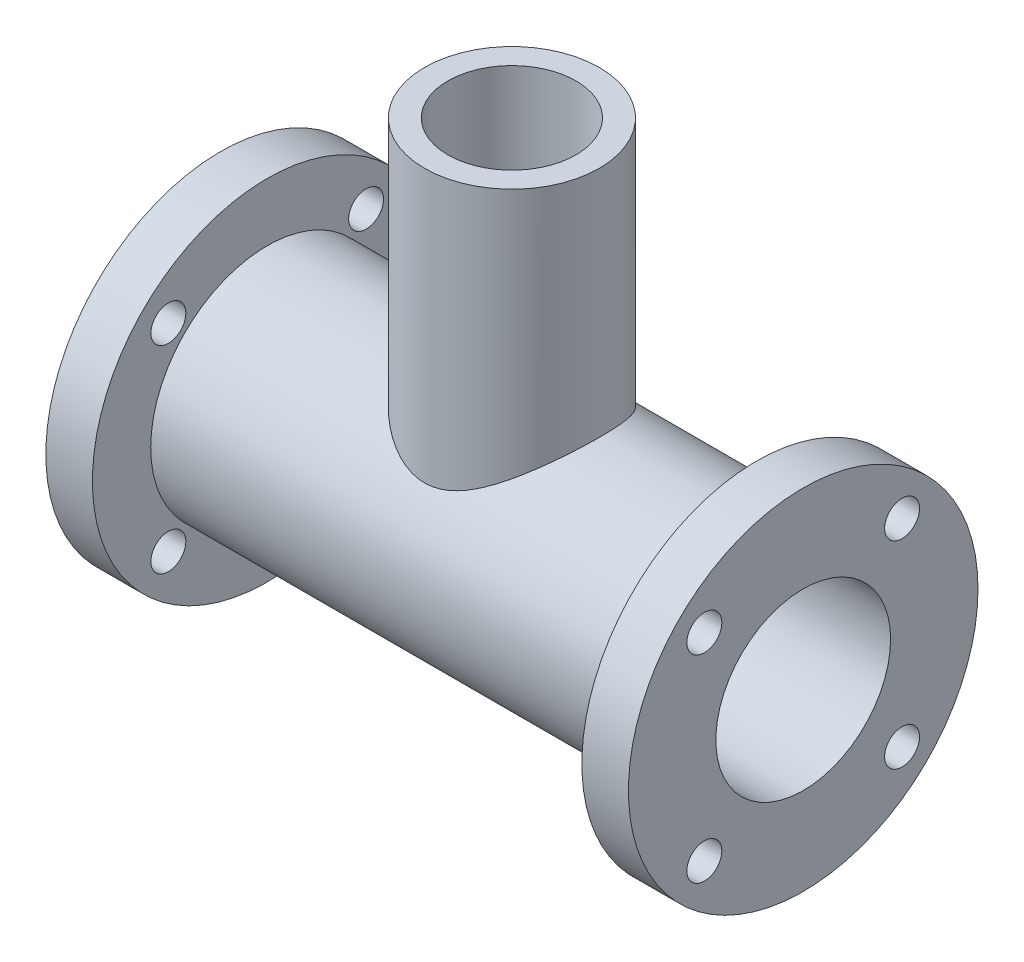
ISO-10303-21;
HEADER;
FILE_DESCRIPTION(('STEP AP214'),'2;1');
FILE_NAME('part.step','',(''),(''),'','','');
FILE_SCHEMA(('AUTOMOTIVE_DESIGN { 1 0 10303 214 1 1 1 1 }'));
ENDSEC;
DATA;
#1=APPLICATION_CONTEXT('core data for automotive mechanical design processes');
#2=APPLICATION_PROTOCOL_DEFINITION('international standard','automotive_design',2000,#1);
#3=PRODUCT_CONTEXT('',#1,'mechanical');
#4=PRODUCT('Part','Part','',(#3));
#5=PRODUCT_RELATED_PRODUCT_CATEGORY('part','',(#4));
#6=PRODUCT_DEFINITION_FORMATION('','',#4);
#7=PRODUCT_DEFINITION_CONTEXT('part definition',#1,'design');
#8=PRODUCT_DEFINITION('design','',#6,#7);
#9=PRODUCT_DEFINITION_SHAPE('','',#8);
#10=(LENGTH_UNIT() NAMED_UNIT(*) SI_UNIT(.MILLI.,.METRE.));
#11=(NAMED_UNIT(*) PLANE_ANGLE_UNIT() SI_UNIT($,.RADIAN.));
#12=(NAMED_UNIT(*) SI_UNIT($,.STERADIAN.) SOLID_ANGLE_UNIT());
#13=UNCERTAINTY_MEASURE_WITH_UNIT(LENGTH_MEASURE(1.E-05),#10,'distance_accuracy_value','');
#14=(GEOMETRIC_REPRESENTATION_CONTEXT(3) GLOBAL_UNCERTAINTY_ASSIGNED_CONTEXT((#13)) GLOBAL_UNIT_ASSIGNED_CONTEXT((#10,
#11,#12)) REPRESENTATION_CONTEXT('',''));
#15=CARTESIAN_POINT('',(0.,0.,0.));
#16=DIRECTION('',(0.,0.,1.));
#17=DIRECTION('',(1.,0.,0.));
#18=AXIS2_PLACEMENT_3D('',#15,#16,#17);
#19=CARTESIAN_POINT('',(50.,0.,0.));
#20=DIRECTION('',(-1.,0.,0.));
#21=DIRECTION('',(0.,0.,1.));
#22=AXIS2_PLACEMENT_3D('',#19,#20,#21);
#23=CYLINDRICAL_SURFACE('',#22,20.);
#24=CARTESIAN_POINT('',(-42.,0.,0.));
#25=DIRECTION('',(1.,0.,0.));
#26=DIRECTION('',(0.,0.,-1.));
#27=AXIS2_PLACEMENT_3D('',#24,#25,#26);
#28=CIRCLE('',#27,20.);
#29=CARTESIAN_POINT('',(-42.,0.,-20.));
#30=VERTEX_POINT('',#29);
#31=EDGE_CURVE('E71',#30,#30,#28,.T.);
#32=ORIENTED_EDGE('',*,*,#31,.T.);
#33=EDGE_LOOP('',(#32));
#34=FACE_BOUND('',#33,.T.);
#35=CARTESIAN_POINT('',(42.,0.,0.));
#36=DIRECTION('',(1.,0.,0.));
#37=DIRECTION('',(0.,0.,-1.));
#38=AXIS2_PLACEMENT_3D('',#35,#36,#37);
#39=CIRCLE('',#38,20.);
#40=CARTESIAN_POINT('',(42.,0.,-20.));
#41=VERTEX_POINT('',#40);
#42=EDGE_CURVE('E64',#41,#41,#39,.T.);
#43=ORIENTED_EDGE('',*,*,#42,.F.);
#44=EDGE_LOOP('',(#43));
#45=FACE_BOUND('',#44,.T.);
#46=CARTESIAN_POINT('',(0.,13.228756555323,-15.));
#47=CARTESIAN_POINT('',(-0.35007989032729,13.2287668094619,-14.9999950153257));
#48=CARTESIAN_POINT('',(-0.700236713845623,13.2427343184002,-14.9877084662531));
#49=CARTESIAN_POINT('',(-1.39674329707938,13.2977503238063,-14.9389130422472));
#50=CARTESIAN_POINT('',(-1.74309174740027,13.3388078555466,-14.9023960857796));
#51=CARTESIAN_POINT('',(-2.42936786240107,13.4456917360412,-14.8060300167238));
#52=CARTESIAN_POINT('',(-2.76927984254846,13.5115720135098,-14.7461300931283));
#53=CARTESIAN_POINT('',(-3.4397076158768,13.6647324664701,-14.6043124055875));
#54=CARTESIAN_POINT('',(-3.77021704322413,13.7520267724489,-14.5223800996731));
#55=CARTESIAN_POINT('',(-4.41546480166887,13.9428350128198,-14.3392663378897));
#56=CARTESIAN_POINT('',(-4.7303610108751,14.0460993413177,-14.2383766850737));
#57=CARTESIAN_POINT('',(-5.34847307548841,14.2661400009491,-14.0178987853672));
#58=CARTESIAN_POINT('',(-5.6516929518917,14.3829116240745,-13.8983170485833));
#59=CARTESIAN_POINT('',(-6.24616943381679,14.6267269354183,-13.6414881549899));
#60=CARTESIAN_POINT('',(-6.5374281132017,14.7537688315145,-13.5042440777257));
#61=CARTESIAN_POINT('',(-7.10791224058062,15.0152639605448,-13.2128793945192));
#62=CARTESIAN_POINT('',(-7.38713681363701,15.1497177307435,-13.0587575643577));
#63=CARTESIAN_POINT('',(-7.99071956284569,15.4521775664433,-12.7002402869969));
#64=CARTESIAN_POINT('',(-8.31227897723436,15.6213119404169,-12.4920767667057));
#65=CARTESIAN_POINT('',(-8.93746542989707,15.9627612947625,-12.0527051205516));
#66=CARTESIAN_POINT('',(-9.24109098977488,16.13507653582,-11.8214950990367));
#67=CARTESIAN_POINT('',(-9.83038305835604,16.4796612724476,-11.336200767858));
#68=CARTESIAN_POINT('',(-10.1160237485836,16.6519303639669,-11.0820847920122));
#69=CARTESIAN_POINT('',(-10.6681497813648,16.9930078783519,-10.5516419021681));
#70=CARTESIAN_POINT('',(-10.934633531495,17.1618160126933,-10.2753131457642));
#71=CARTESIAN_POINT('',(-11.4998486946518,17.5268619129745,-9.64202111520891));
#72=CARTESIAN_POINT('',(-11.7940279078987,17.7216481226697,-9.2801252453224));
#73=CARTESIAN_POINT('',(-12.3505638493801,18.0968011898211,-8.52545502777757));
#74=CARTESIAN_POINT('',(-12.6129134212813,18.2771648015145,-8.13267376867953));
#75=CARTESIAN_POINT('',(-13.1020621368342,18.6180919097207,-7.31854084159984));
#76=CARTESIAN_POINT('',(-13.3289282198199,18.7786925637549,-6.89724517173384));
#77=CARTESIAN_POINT('',(-13.7439395955394,19.0755036601499,-6.02791743999363));
#78=CARTESIAN_POINT('',(-13.9321053715779,19.2117269999534,-5.57989968441866));
#79=CARTESIAN_POINT('',(-14.2155206181019,19.4184117702375,-4.79954239415013));
#80=CARTESIAN_POINT('',(-14.3216751503084,19.4963138119554,-4.47308557241265));
#81=CARTESIAN_POINT('',(-14.5119991391525,19.6365467152,-3.81058674167509));
#82=CARTESIAN_POINT('',(-14.5961738392268,19.6988812902957,-3.47454703999168));
#83=CARTESIAN_POINT('',(-14.7413760869837,19.8067111708165,-2.79507530852944));
#84=CARTESIAN_POINT('',(-14.8024190854446,19.8522177160016,-2.45164837563999));
#85=CARTESIAN_POINT('',(-14.9005493680025,19.9254938188065,-1.75948746314503));
#86=CARTESIAN_POINT('',(-14.9376357933791,19.9532627406231,-1.41075329376086));
#87=CARTESIAN_POINT('',(-14.9873357006868,19.9904967082937,-0.709643343864726));
#88=CARTESIAN_POINT('',(-14.9998847978291,19.9999135990731,-0.357260415366052));
#89=CARTESIAN_POINT('',(-15.0001136198624,20.0000852141955,0.347516775524046));
#90=CARTESIAN_POINT('',(-14.9877934431648,19.9908400123871,0.699911037865103));
#91=CARTESIAN_POINT('',(-14.9384782769663,19.9538935464116,1.40205493706976));
#92=CARTESIAN_POINT('',(-14.901478409887,19.926188633955,1.75180403733445));
#93=CARTESIAN_POINT('',(-14.8033777740602,19.8529325341786,2.44599527790974));
#94=CARTESIAN_POINT('',(-14.7422771652691,19.8073814653035,2.79043745342655));
#95=CARTESIAN_POINT('',(-14.5993796559603,19.7012609038883,3.45994787566955));
#96=CARTESIAN_POINT('',(-14.5183665754014,19.6412616302281,3.78527506214432));
#97=CARTESIAN_POINT('',(-14.3357338481969,19.506651612435,4.4269651160663));
#98=CARTESIAN_POINT('',(-14.2341148219447,19.4320413082059,4.74332825307189));
#99=CARTESIAN_POINT('',(-14.0114083976574,19.2695036472713,5.36559938852795));
#100=CARTESIAN_POINT('',(-13.8903200079904,19.1815756122678,5.67150685347756));
#101=CARTESIAN_POINT('',(-13.6298601756864,18.9938132834954,6.27167876281055));
#102=CARTESIAN_POINT('',(-13.4904862401191,18.8939773664536,6.56594161251113));
#103=CARTESIAN_POINT('',(-13.1786322414654,18.672520363577,7.17303017708289));
#104=CARTESIAN_POINT('',(-13.0042018371785,18.5497109290933,7.4844202707271));
#105=CARTESIAN_POINT('',(-12.6358530539302,18.2933673193193,8.09080316859151));
#106=CARTESIAN_POINT('',(-12.4419334865934,18.1598324901349,8.38579497120065));
#107=CARTESIAN_POINT('',(-12.0358210694146,17.8840361714195,8.95893137316532));
#108=CARTESIAN_POINT('',(-11.8236161634749,17.7417689423997,9.23706464813135));
#109=CARTESIAN_POINT('',(-11.3821811130353,17.4506880226699,9.77585129777695));
#110=CARTESIAN_POINT('',(-11.1529492476372,17.3018736708699,10.0365029005209));
#111=CARTESIAN_POINT('',(-10.6316991686249,16.9701205767747,10.5895421004239));
#112=CARTESIAN_POINT('',(-10.3362007154333,16.7862279061822,10.878085644726));
#113=CARTESIAN_POINT('',(-9.7233038384538,16.4159365254069,11.4292287850781));
#114=CARTESIAN_POINT('',(-9.40590119891681,16.2295373384013,11.6918233631243));
#115=CARTESIAN_POINT('',(-8.74979915450459,15.858302340693,12.1906083543206));
#116=CARTESIAN_POINT('',(-8.41108857565742,15.6734674089103,12.4267847302495));
#117=CARTESIAN_POINT('',(-7.71294764061094,15.3101499386323,12.8717420275264));
#118=CARTESIAN_POINT('',(-7.35352193904427,15.1316659875544,13.0805290689084));
#119=CARTESIAN_POINT('',(-6.68701295227638,14.8205031013214,13.4311696944969));
#120=CARTESIAN_POINT('',(-6.38357579620466,14.6857297334454,13.5781048697272));
#121=CARTESIAN_POINT('',(-5.76355405942468,14.4270297328062,13.8526668341882));
#122=CARTESIAN_POINT('',(-5.44696962786256,14.3031029770457,13.9802938423796));
#123=CARTESIAN_POINT('',(-4.80163600989962,14.0700166455556,14.2148490534225));
#124=CARTESIAN_POINT('',(-4.47291052978962,13.9608300481304,14.3218152911567));
#125=CARTESIAN_POINT('',(-3.80362399005992,13.7610209649693,14.5139086704768));
#126=CARTESIAN_POINT('',(-3.4630660427737,13.6703936401216,14.5990415063297));
#127=CARTESIAN_POINT('',(-2.84026434696751,13.5275389713065,14.7313679472066));
#128=CARTESIAN_POINT('',(-2.55983497252504,13.4712610794501,14.7827364870528));
#129=CARTESIAN_POINT('',(-1.99372983448241,13.3752461877063,14.8696672529289));
#130=CARTESIAN_POINT('',(-1.70805474733861,13.3355070704999,14.9052315022874));
#131=CARTESIAN_POINT('',(-1.13349558316175,13.2741604984585,14.959891833129));
#132=CARTESIAN_POINT('',(-0.844615334096402,13.2525333708564,14.9790057831212));
#133=CARTESIAN_POINT('',(-0.265421830878931,13.2282555633106,15.0004508078897));
#134=CARTESIAN_POINT('',(0.0248914379791947,13.2256050785168,15.0027817100745));
#135=CARTESIAN_POINT('',(0.60479891875946,13.2394003046486,14.9906090629994));
#136=CARTESIAN_POINT('',(0.894392862565885,13.2558523010735,14.9760999726925));
#137=CARTESIAN_POINT('',(1.47060869461576,13.3071526572066,14.9305342015992));
#138=CARTESIAN_POINT('',(1.75723057945352,13.3420010379927,14.899477501853));
#139=CARTESIAN_POINT('',(2.32600868418222,13.4287449861106,14.821342763958));
#140=CARTESIAN_POINT('',(2.60815892332743,13.4806616469267,14.7742448990591));
#141=CARTESIAN_POINT('',(3.16634198771834,13.599679206039,14.6647622054555));
#142=CARTESIAN_POINT('',(3.44237112067613,13.6667890093158,14.6023684097396));
#143=CARTESIAN_POINT('',(4.08915667335947,13.8416512274319,14.4370383650048));
#144=CARTESIAN_POINT('',(4.45670766039784,13.9552149092084,14.3276679286621));
#145=CARTESIAN_POINT('',(5.17650775566882,14.2014688311673,14.0836178702821));
#146=CARTESIAN_POINT('',(5.52875682065086,14.3341591254059,13.9489381767143));
#147=CARTESIAN_POINT('',(6.21795386001206,14.6138150964665,13.6556771716543));
#148=CARTESIAN_POINT('',(6.55487655591901,14.7608031856442,13.4970581124334));
#149=CARTESIAN_POINT('',(7.21256450610969,15.0643947755603,13.1573517779834));
#150=CARTESIAN_POINT('',(7.53333121606221,15.2209974071885,12.9762665320879));
#151=CARTESIAN_POINT('',(8.16973820461822,15.5456452157281,12.58569310029));
#152=CARTESIAN_POINT('',(8.48479239336158,15.7138992428473,12.375424903332));
#153=CARTESIAN_POINT('',(9.09725927872176,16.0528843684044,11.932422780117));
#154=CARTESIAN_POINT('',(9.3946719071635,16.2236154764118,11.6996887670508));
#155=CARTESIAN_POINT('',(9.97152383545865,16.5643325768962,11.2121086847205));
#156=CARTESIAN_POINT('',(10.2509551692435,16.7343182084577,10.9572529309388));
#157=CARTESIAN_POINT('',(10.7909545658109,17.0704442564019,10.425872067627));
#158=CARTESIAN_POINT('',(11.0515204844792,17.2365842342586,10.149344502441));
#159=CARTESIAN_POINT('',(11.6074930001012,17.5977256226589,9.51219255190244));
#160=CARTESIAN_POINT('',(11.8980704729062,17.791100358514,9.14639590077838));
#161=CARTESIAN_POINT('',(12.4470273815066,18.1628116618176,8.38404078648336));
#162=CARTESIAN_POINT('',(12.7053995084894,18.3411448127091,7.98747537353446));
#163=CARTESIAN_POINT('',(13.1861994708645,18.6774302216855,7.16591048622996));
#164=CARTESIAN_POINT('',(13.4086879809183,18.835416790138,6.74096076434239));
#165=CARTESIAN_POINT('',(13.8144291894275,19.1263812242272,5.86466860638735));
#166=CARTESIAN_POINT('',(13.9977030632752,19.2593725822092,5.41334058274982));
#167=CARTESIAN_POINT('',(14.2718936292022,19.459730248052,4.62917373862269));
#168=CARTESIAN_POINT('',(14.3739365835652,19.5347457585876,4.30212897093934));
#169=CARTESIAN_POINT('',(14.5559953401008,19.6690928432019,3.63884319439732));
#170=CARTESIAN_POINT('',(14.636016389643,19.7284281534177,3.30260439731683));
#171=CARTESIAN_POINT('',(14.7729141880237,19.8302017235116,2.62317001158236));
#172=CARTESIAN_POINT('',(14.8298071056262,19.8726517873344,2.27997945968527));
#173=CARTESIAN_POINT('',(14.9196977597463,19.9398216316173,1.58873612359809));
#174=CARTESIAN_POINT('',(14.952694603447,19.9645407496047,1.24068315823128));
#175=CARTESIAN_POINT('',(14.9943238587307,19.9957384632415,0.541474492697201));
#176=CARTESIAN_POINT('',(15.0028984998101,20.0021738087005,0.190313403435986));
#177=CARTESIAN_POINT('',(14.9953811079746,19.9965359133247,-0.511592990667793));
#178=CARTESIAN_POINT('',(14.9792891815465,19.9844627523921,-0.86233829729877));
#179=CARTESIAN_POINT('',(14.9226897715004,19.9420741038168,-1.56081145560467));
#180=CARTESIAN_POINT('',(14.8821767813828,19.9117545019407,-1.90853860879859));
#181=CARTESIAN_POINT('',(14.777354847715,19.833532218091,-2.59836537760192));
#182=CARTESIAN_POINT('',(14.7130459694679,19.7856295843706,-2.94046500865226));
#183=CARTESIAN_POINT('',(14.5637744447821,19.674884998029,-3.60689226548104));
#184=CARTESIAN_POINT('',(14.479468758544,19.6125194180855,-3.93144723244009));
#185=CARTESIAN_POINT('',(14.2903589794546,19.4733218556302,-4.57131772524202));
#186=CARTESIAN_POINT('',(14.1855554277881,19.3964902550525,-4.88663349476556));
#187=CARTESIAN_POINT('',(13.956606108617,19.2296829430498,-5.50657313611678));
#188=CARTESIAN_POINT('',(13.832459498779,19.1397066592232,-5.81119654161524));
#189=CARTESIAN_POINT('',(13.5660152984595,18.9480396801916,-6.40860618970159));
#190=CARTESIAN_POINT('',(13.4237152150449,18.8463473762657,-6.70139079923589));
#191=CARTESIAN_POINT('',(13.1050742462932,18.6206584147314,-7.30663089336774));
#192=CARTESIAN_POINT('',(12.9267034353406,18.4954400037626,-7.6175619658255));
#193=CARTESIAN_POINT('',(12.5504514430556,18.2344581814665,-8.22272146933625));
#194=CARTESIAN_POINT('',(12.3525690078843,18.0986940925811,-8.51694882507265));
#195=CARTESIAN_POINT('',(11.9384878595632,17.8186477318126,-9.08829347242128));
#196=CARTESIAN_POINT('',(11.7222758322296,17.6743592915048,-9.36539806945599));
#197=CARTESIAN_POINT('',(11.272785147503,17.379496836765,-9.90185836582753));
#198=CARTESIAN_POINT('',(11.039504790692,17.2289221970866,-10.1612122928195));
#199=CARTESIAN_POINT('',(10.5090255588305,16.8934717672604,-10.7113912860453));
#200=CARTESIAN_POINT('',(10.2083115792521,16.7077032391573,-10.9982918518405));
#201=CARTESIAN_POINT('',(9.58480793920615,16.3342031868818,-11.5457188771075));
#202=CARTESIAN_POINT('',(9.26201378679676,16.1464712699017,-11.8062399430944));
#203=CARTESIAN_POINT('',(8.59493671544193,15.7732825072833,-12.3003840181327));
#204=CARTESIAN_POINT('',(8.25064427836285,15.5878267134798,-12.533994980937));
#205=CARTESIAN_POINT('',(7.54109685973899,15.2241691356996,-12.9732767636357));
#206=CARTESIAN_POINT('',(7.17584732772951,15.0459654863431,-13.1789548005939));
#207=CARTESIAN_POINT('',(6.50569680145343,14.739591464473,-13.5198025955659));
#208=CARTESIAN_POINT('',(6.2047954327093,14.6089264666881,-13.6606071888684));
#209=CARTESIAN_POINT('',(5.59032001058174,14.3587235645311,-13.9233601052075));
#210=CARTESIAN_POINT('',(5.27674592516651,14.2391856882866,-14.0453083805789));
#211=CARTESIAN_POINT('',(4.63807310454958,14.0150818806935,-14.2689347523681));
#212=CARTESIAN_POINT('',(4.31300157182113,13.9104832199046,-14.3706573580315));
#213=CARTESIAN_POINT('',(3.65163191033226,13.7198513131379,-14.5527693679539));
#214=CARTESIAN_POINT('',(3.31533775359849,13.6338115774015,-14.6331662317494));
#215=CARTESIAN_POINT('',(2.73320744189076,13.5061115597092,-14.7509361092654));
#216=CARTESIAN_POINT('',(2.48974190614326,13.4588347665988,-14.7940129558023));
#217=CARTESIAN_POINT('',(1.99894339930636,13.3767441497761,-14.8682813627462));
#218=CARTESIAN_POINT('',(1.7516111916392,13.3419278975367,-14.8994752391896));
#219=CARTESIAN_POINT('',(1.25425989973598,13.2857881327445,-14.9495572242127));
#220=CARTESIAN_POINT('',(1.0042418417122,13.2644596410529,-14.9684498739869));
#221=CARTESIAN_POINT('',(0.502828901264541,13.2359415308446,-14.993671842706));
#222=CARTESIAN_POINT('',(0.251434293226178,13.2287491905978,-15.0000035800916));
#223=CARTESIAN_POINT('',(0.,13.228756555323,-15.));
#224=B_SPLINE_CURVE_WITH_KNOTS('',3,(#46,#47,#48,#49,#50,#51,#52,#53,#54,#55,#56,#57,#58,#59,
#60,#61,#62,#63,#64,#65,#66,#67,#68,#69,#70,#71,#72,#73,#74,#75,#76,#77,#78,#79,#80,#81,#82,#83,
#84,#85,#86,#87,#88,#89,#90,#91,#92,#93,#94,#95,#96,#97,#98,#99,#100,#101,#102,#103,#104,#105,
#106,#107,#108,#109,#110,#111,#112,#113,#114,#115,#116,#117,#118,#119,#120,#121,#122,#123,#124,
#125,#126,#127,#128,#129,#130,#131,#132,#133,#134,#135,#136,#137,#138,#139,#140,#141,#142,#143,
#144,#145,#146,#147,#148,#149,#150,#151,#152,#153,#154,#155,#156,#157,#158,#159,#160,#161,#162,
#163,#164,#165,#166,#167,#168,#169,#170,#171,#172,#173,#174,#175,#176,#177,#178,#179,#180,#181,
#182,#183,#184,#185,#186,#187,#188,#189,#190,#191,#192,#193,#194,#195,#196,#197,#198,#199,#200,
#201,#202,#203,#204,#205,#206,#207,#208,#209,#210,#211,#212,#213,#214,#215,#216,#217,#218,#219,
#220,#221,#222,#223),.UNSPECIFIED.,.T.,.F.,(4,2,2,2,2,2,2,2,2,2,2,2,2,2,2,2,2,2,2,2,2,2,2,2,2,2,
2,2,2,2,2,2,2,2,2,2,2,2,2,2,2,2,2,2,2,2,2,2,2,2,2,2,2,2,2,2,2,2,2,2,2,2,2,2,2,2,2,2,2,2,2,2,2,2,
2,2,2,2,2,2,2,2,2,2,2,2,2,2,4),(0.,1.04989330861708,2.10013696283711,3.15267560731799,
4.20591066822567,5.24409491293171,6.281918379648,7.31956113954819,8.35727921425455,
9.61238500518646,10.8675941180988,12.1245659086803,13.3816420646879,14.895830090393,
16.4103579261517,17.9219932288365,19.4328263822249,20.4878122457488,21.5425462049,
22.5965744093589,23.650640393229,24.7074685043307,25.7642924334173,26.8213252901474,
27.8783511314818,28.8990338141559,29.9196857711868,30.9403897294914,31.9612329887077,
33.0925115159599,34.2238590661888,35.3559583421496,36.4881721943811,37.8431193809285,
39.1983280761281,40.5542534701806,41.9098753703415,42.9983087099469,44.086729705451,
45.1731274949134,46.259241657274,47.1301725976505,48.0009920058081,48.870864321519,
49.7407455827085,50.6109131516153,51.4810817175366,52.3523297314392,53.2240897280182,
54.4220718811339,55.6200574201004,56.8199520758421,58.019738425887,59.2621109686766,
60.5044883122505,61.7474123171771,62.9904773633289,64.5051805768846,66.0202269199134,
67.5326840275843,69.0443223554234,70.0954081717346,71.1462433185058,72.1963425629496,
73.2464810396974,74.2991015548631,75.3517175258255,76.4045709311072,77.4574214470615,
78.4795702327716,79.501692035347,80.5238583607715,81.5461652070039,82.6841827772842,
83.8222735255751,84.961198158005,86.1002363428389,87.4646132818958,88.8292686170742,
90.1945324824979,91.5594429292264,92.6296192030643,93.6997981820698,94.7675953717639,
95.8350185623951,96.5896437436554,97.344121770232,98.0983211110213,98.8523752264069),.UNSPECIFIED.);
#225=CARTESIAN_POINT('',(0.,13.228756555323,-15.));
#226=VERTEX_POINT('',#225);
#227=EDGE_CURVE('E10',#226,#226,#224,.T.);
#228=ORIENTED_EDGE('',*,*,#227,.F.);
#229=EDGE_LOOP('',(#228));
#230=FACE_BOUND('',#229,.T.);
#231=ADVANCED_FACE('F49',(#34,#45,#230),#23,.T.);
#232=CARTESIAN_POINT('',(-42.,0.,0.));
#233=DIRECTION('',(-1.,0.,0.));
#234=DIRECTION('',(0.,0.,1.));
#235=AXIS2_PLACEMENT_3D('',#232,#233,#234);
#236=CYLINDRICAL_SURFACE('',#235,30.);
#237=CARTESIAN_POINT('',(-42.,0.,0.));
#238=DIRECTION('',(1.,0.,0.));
#239=DIRECTION('',(0.,0.,-1.));
#240=AXIS2_PLACEMENT_3D('',#237,#238,#239);
#241=CIRCLE('',#240,30.);
#242=CARTESIAN_POINT('',(-42.,0.,-30.));
#243=VERTEX_POINT('',#242);
#244=EDGE_CURVE('E147',#243,#243,#241,.T.);
#245=ORIENTED_EDGE('',*,*,#244,.F.);
#246=EDGE_LOOP('',(#245));
#247=FACE_BOUND('',#246,.T.);
#248=CARTESIAN_POINT('',(-50.,0.,0.));
#249=DIRECTION('',(1.,0.,0.));
#250=DIRECTION('',(0.,0.,-1.));
#251=AXIS2_PLACEMENT_3D('',#248,#249,#250);
#252=CIRCLE('',#251,30.);
#253=CARTESIAN_POINT('',(-50.,0.,-30.));
#254=VERTEX_POINT('',#253);
#255=EDGE_CURVE('E140',#254,#254,#252,.T.);
#256=ORIENTED_EDGE('',*,*,#255,.T.);
#257=EDGE_LOOP('',(#256));
#258=FACE_BOUND('',#257,.T.);
#259=ADVANCED_FACE('F106',(#247,#258),#236,.T.);
#260=CARTESIAN_POINT('',(-42.,0.,0.));
#261=DIRECTION('',(1.,0.,0.));
#262=DIRECTION('',(0.,0.,-1.));
#263=AXIS2_PLACEMENT_3D('',#260,#261,#262);
#264=PLANE('',#263);
#265=CARTESIAN_POINT('',(-42.,-16.970563,16.970563));
#266=DIRECTION('',(1.,0.,0.));
#267=DIRECTION('',(0.,0.,-1.));
#268=AXIS2_PLACEMENT_3D('',#265,#266,#267);
#269=CIRCLE('',#268,3.);
#270=CARTESIAN_POINT('',(-42.,-16.970563,13.970563));
#271=VERTEX_POINT('',#270);
#272=EDGE_CURVE('E183',#271,#271,#269,.T.);
#273=ORIENTED_EDGE('',*,*,#272,.F.);
#274=EDGE_LOOP('',(#273));
#275=FACE_BOUND('',#274,.T.);
#276=CARTESIAN_POINT('',(-42.,-16.970563,-16.970563));
#277=DIRECTION('',(1.,0.,0.));
#278=DIRECTION('',(0.,0.,-1.));
#279=AXIS2_PLACEMENT_3D('',#276,#277,#278);
#280=CIRCLE('',#279,3.);
#281=CARTESIAN_POINT('',(-42.,-16.970563,-19.970563));
#282=VERTEX_POINT('',#281);
#283=EDGE_CURVE('E201',#282,#282,#280,.T.);
#284=ORIENTED_EDGE('',*,*,#283,.F.);
#285=EDGE_LOOP('',(#284));
#286=FACE_BOUND('',#285,.T.);
#287=CARTESIAN_POINT('',(-42.,16.970563,-16.970563));
#288=DIRECTION('',(1.,0.,0.));
#289=DIRECTION('',(0.,0.,-1.));
#290=AXIS2_PLACEMENT_3D('',#287,#288,#289);
#291=CIRCLE('',#290,3.);
#292=CARTESIAN_POINT('',(-42.,16.970563,-19.970563));
#293=VERTEX_POINT('',#292);
#294=EDGE_CURVE('E193',#293,#293,#291,.T.);
#295=ORIENTED_EDGE('',*,*,#294,.F.);
#296=EDGE_LOOP('',(#295));
#297=FACE_BOUND('',#296,.T.);
#298=CARTESIAN_POINT('',(-42.,16.970563,16.970563));
#299=DIRECTION('',(1.,0.,0.));
#300=DIRECTION('',(0.,0.,-1.));
#301=AXIS2_PLACEMENT_3D('',#298,#299,#300);
#302=CIRCLE('',#301,3.);
#303=CARTESIAN_POINT('',(-42.,16.970563,13.970563));
#304=VERTEX_POINT('',#303);
#305=EDGE_CURVE('E211',#304,#304,#302,.T.);
#306=ORIENTED_EDGE('',*,*,#305,.F.);
#307=EDGE_LOOP('',(#306));
#308=FACE_BOUND('',#307,.T.);
#309=ORIENTED_EDGE('',*,*,#31,.F.);
#310=EDGE_LOOP('',(#309));
#311=FACE_BOUND('',#310,.T.);
#312=ORIENTED_EDGE('',*,*,#244,.T.);
#313=EDGE_LOOP('',(#312));
#314=FACE_BOUND('',#313,.T.);
#315=ADVANCED_FACE('F102',(#275,#286,#297,#308,#311,#314),#264,.T.);
#316=CARTESIAN_POINT('',(-50.,0.,0.));
#317=DIRECTION('',(1.,0.,0.));
#318=DIRECTION('',(0.,0.,-1.));
#319=AXIS2_PLACEMENT_3D('',#316,#317,#318);
#320=PLANE('',#319);
#321=CARTESIAN_POINT('',(-50.,-16.970563,16.970563));
#322=DIRECTION('',(1.,0.,0.));
#323=DIRECTION('',(0.,0.,-1.));
#324=AXIS2_PLACEMENT_3D('',#321,#322,#323);
#325=CIRCLE('',#324,3.);
#326=CARTESIAN_POINT('',(-50.,-16.970563,13.970563));
#327=VERTEX_POINT('',#326);
#328=EDGE_CURVE('E205',#327,#327,#325,.T.);
#329=ORIENTED_EDGE('',*,*,#328,.T.);
#330=EDGE_LOOP('',(#329));
#331=FACE_BOUND('',#330,.T.);
#332=CARTESIAN_POINT('',(-50.,-16.970563,-16.970563));
#333=DIRECTION('',(1.,0.,0.));
#334=DIRECTION('',(0.,0.,-1.));
#335=AXIS2_PLACEMENT_3D('',#332,#333,#334);
#336=CIRCLE('',#335,3.);
#337=CARTESIAN_POINT('',(-50.,-16.970563,-19.970563));
#338=VERTEX_POINT('',#337);
#339=EDGE_CURVE('E197',#338,#338,#336,.T.);
#340=ORIENTED_EDGE('',*,*,#339,.T.);
#341=EDGE_LOOP('',(#340));
#342=FACE_BOUND('',#341,.T.);
#343=CARTESIAN_POINT('',(-50.,16.970563,-16.970563));
#344=DIRECTION('',(1.,0.,0.));
#345=DIRECTION('',(0.,0.,-1.));
#346=AXIS2_PLACEMENT_3D('',#343,#344,#345);
#347=CIRCLE('',#346,3.);
#348=CARTESIAN_POINT('',(-50.,16.970563,-19.970563));
#349=VERTEX_POINT('',#348);
#350=EDGE_CURVE('E188',#349,#349,#347,.T.);
#351=ORIENTED_EDGE('',*,*,#350,.T.);
#352=EDGE_LOOP('',(#351));
#353=FACE_BOUND('',#352,.T.);
#354=CARTESIAN_POINT('',(-50.,16.970563,16.970563));
#355=DIRECTION('',(1.,0.,0.));
#356=DIRECTION('',(0.,0.,-1.));
#357=AXIS2_PLACEMENT_3D('',#354,#355,#356);
#358=CIRCLE('',#357,3.);
#359=CARTESIAN_POINT('',(-50.,16.970563,13.970563));
#360=VERTEX_POINT('',#359);
#361=EDGE_CURVE('E192',#360,#360,#358,.T.);
#362=ORIENTED_EDGE('',*,*,#361,.T.);
#363=EDGE_LOOP('',(#362));
#364=FACE_BOUND('',#363,.T.);
#365=CARTESIAN_POINT('',(-50.,0.,0.));
#366=DIRECTION('',(1.,0.,0.));
#367=DIRECTION('',(0.,0.,-1.));
#368=AXIS2_PLACEMENT_3D('',#365,#366,#367);
#369=CIRCLE('',#368,15.);
#370=CARTESIAN_POINT('',(-50.,0.,-15.));
#371=VERTEX_POINT('',#370);
#372=EDGE_CURVE('E154',#371,#371,#369,.T.);
#373=ORIENTED_EDGE('',*,*,#372,.T.);
#374=EDGE_LOOP('',(#373));
#375=FACE_BOUND('',#374,.T.);
#376=ORIENTED_EDGE('',*,*,#255,.F.);
#377=EDGE_LOOP('',(#376));
#378=FACE_BOUND('',#377,.T.);
#379=ADVANCED_FACE('F99',(#331,#342,#353,#364,#375,#378),#320,.F.);
#380=CARTESIAN_POINT('',(50.,0.,0.));
#381=DIRECTION('',(-1.,0.,0.));
#382=DIRECTION('',(0.,0.,1.));
#383=AXIS2_PLACEMENT_3D('',#380,#381,#382);
#384=CYLINDRICAL_SURFACE('',#383,30.);
#385=CARTESIAN_POINT('',(50.,0.,0.));
#386=DIRECTION('',(1.,0.,0.));
#387=DIRECTION('',(0.,0.,-1.));
#388=AXIS2_PLACEMENT_3D('',#385,#386,#387);
#389=CIRCLE('',#388,30.);
#390=CARTESIAN_POINT('',(50.,0.,-30.));
#391=VERTEX_POINT('',#390);
#392=EDGE_CURVE('E133',#391,#391,#389,.T.);
#393=ORIENTED_EDGE('',*,*,#392,.F.);
#394=EDGE_LOOP('',(#393));
#395=FACE_BOUND('',#394,.T.);
#396=CARTESIAN_POINT('',(42.,0.,0.));
#397=DIRECTION('',(1.,0.,0.));
#398=DIRECTION('',(0.,0.,-1.));
#399=AXIS2_PLACEMENT_3D('',#396,#397,#398);
#400=CIRCLE('',#399,30.);
#401=CARTESIAN_POINT('',(42.,0.,-30.));
#402=VERTEX_POINT('',#401);
#403=EDGE_CURVE('E130',#402,#402,#400,.T.);
#404=ORIENTED_EDGE('',*,*,#403,.T.);
#405=EDGE_LOOP('',(#404));
#406=FACE_BOUND('',#405,.T.);
#407=ADVANCED_FACE('F94',(#395,#406),#384,.T.);
#408=CARTESIAN_POINT('',(42.,0.,0.));
#409=DIRECTION('',(1.,0.,0.));
#410=DIRECTION('',(0.,0.,-1.));
#411=AXIS2_PLACEMENT_3D('',#408,#409,#410);
#412=PLANE('',#411);
#413=CARTESIAN_POINT('',(42.,-16.970563,16.970563));
#414=DIRECTION('',(1.,0.,0.));
#415=DIRECTION('',(0.,0.,-1.));
#416=AXIS2_PLACEMENT_3D('',#413,#414,#415);
#417=CIRCLE('',#416,3.);
#418=CARTESIAN_POINT('',(42.,-16.970563,13.970563));
#419=VERTEX_POINT('',#418);
#420=EDGE_CURVE('E176',#419,#419,#417,.T.);
#421=ORIENTED_EDGE('',*,*,#420,.T.);
#422=EDGE_LOOP('',(#421));
#423=FACE_BOUND('',#422,.T.);
#424=CARTESIAN_POINT('',(42.,-16.970563,-16.970563));
#425=DIRECTION('',(1.,0.,0.));
#426=DIRECTION('',(0.,0.,-1.));
#427=AXIS2_PLACEMENT_3D('',#424,#425,#426);
#428=CIRCLE('',#427,3.);
#429=CARTESIAN_POINT('',(42.,-16.970563,-19.970563));
#430=VERTEX_POINT('',#429);
#431=EDGE_CURVE('E160',#430,#430,#428,.T.);
#432=ORIENTED_EDGE('',*,*,#431,.T.);
#433=EDGE_LOOP('',(#432));
#434=FACE_BOUND('',#433,.T.);
#435=CARTESIAN_POINT('',(42.,16.970563,-16.970563));
#436=DIRECTION('',(1.,0.,0.));
#437=DIRECTION('',(0.,0.,-1.));
#438=AXIS2_PLACEMENT_3D('',#435,#436,#437);
#439=CIRCLE('',#438,3.);
#440=CARTESIAN_POINT('',(42.,16.970563,-19.970563));
#441=VERTEX_POINT('',#440);
#442=EDGE_CURVE('E159',#441,#441,#439,.T.);
#443=ORIENTED_EDGE('',*,*,#442,.T.);
#444=EDGE_LOOP('',(#443));
#445=FACE_BOUND('',#444,.T.);
#446=CARTESIAN_POINT('',(42.,16.970563,16.970563));
#447=DIRECTION('',(1.,0.,0.));
#448=DIRECTION('',(0.,0.,-1.));
#449=AXIS2_PLACEMENT_3D('',#446,#447,#448);
#450=CIRCLE('',#449,3.);
#451=CARTESIAN_POINT('',(42.,16.970563,13.970563));
#452=VERTEX_POINT('',#451);
#453=EDGE_CURVE('E179',#452,#452,#450,.T.);
#454=ORIENTED_EDGE('',*,*,#453,.T.);
#455=EDGE_LOOP('',(#454));
#456=FACE_BOUND('',#455,.T.);
#457=ORIENTED_EDGE('',*,*,#42,.T.);
#458=EDGE_LOOP('',(#457));
#459=FACE_BOUND('',#458,.T.);
#460=ORIENTED_EDGE('',*,*,#403,.F.);
#461=EDGE_LOOP('',(#460));
#462=FACE_BOUND('',#461,.T.);
#463=ADVANCED_FACE('F90',(#423,#434,#445,#456,#459,#462),#412,.F.);
#464=CARTESIAN_POINT('',(50.,0.,0.));
#465=DIRECTION('',(1.,0.,0.));
#466=DIRECTION('',(0.,0.,-1.));
#467=AXIS2_PLACEMENT_3D('',#464,#465,#466);
#468=PLANE('',#467);
#469=CARTESIAN_POINT('',(50.,-16.970563,16.970563));
#470=DIRECTION('',(1.,0.,0.));
#471=DIRECTION('',(0.,0.,-1.));
#472=AXIS2_PLACEMENT_3D('',#469,#470,#471);
#473=CIRCLE('',#472,3.);
#474=CARTESIAN_POINT('',(50.,-16.970563,13.970563));
#475=VERTEX_POINT('',#474);
#476=EDGE_CURVE('E170',#475,#475,#473,.T.);
#477=ORIENTED_EDGE('',*,*,#476,.F.);
#478=EDGE_LOOP('',(#477));
#479=FACE_BOUND('',#478,.T.);
#480=CARTESIAN_POINT('',(50.,-16.970563,-16.970563));
#481=DIRECTION('',(1.,0.,0.));
#482=DIRECTION('',(0.,0.,-1.));
#483=AXIS2_PLACEMENT_3D('',#480,#481,#482);
#484=CIRCLE('',#483,3.);
#485=CARTESIAN_POINT('',(50.,-16.970563,-19.970563));
#486=VERTEX_POINT('',#485);
#487=EDGE_CURVE('E157',#486,#486,#484,.T.);
#488=ORIENTED_EDGE('',*,*,#487,.F.);
#489=EDGE_LOOP('',(#488));
#490=FACE_BOUND('',#489,.T.);
#491=CARTESIAN_POINT('',(50.,16.970563,-16.970563));
#492=DIRECTION('',(1.,0.,0.));
#493=DIRECTION('',(0.,0.,-1.));
#494=AXIS2_PLACEMENT_3D('',#491,#492,#493);
#495=CIRCLE('',#494,3.);
#496=CARTESIAN_POINT('',(50.,16.970563,-19.970563));
#497=VERTEX_POINT('',#496);
#498=EDGE_CURVE('E166',#497,#497,#495,.T.);
#499=ORIENTED_EDGE('',*,*,#498,.F.);
#500=EDGE_LOOP('',(#499));
#501=FACE_BOUND('',#500,.T.);
#502=CARTESIAN_POINT('',(50.,16.970563,16.970563));
#503=DIRECTION('',(1.,0.,0.));
#504=DIRECTION('',(0.,0.,-1.));
#505=AXIS2_PLACEMENT_3D('',#502,#503,#504);
#506=CIRCLE('',#505,3.);
#507=CARTESIAN_POINT('',(50.,16.970563,13.970563));
#508=VERTEX_POINT('',#507);
#509=EDGE_CURVE('E184',#508,#508,#506,.T.);
#510=ORIENTED_EDGE('',*,*,#509,.F.);
#511=EDGE_LOOP('',(#510));
#512=FACE_BOUND('',#511,.T.);
#513=CARTESIAN_POINT('',(50.,0.,0.));
#514=DIRECTION('',(1.,0.,0.));
#515=DIRECTION('',(0.,0.,-1.));
#516=AXIS2_PLACEMENT_3D('',#513,#514,#515);
#517=CIRCLE('',#516,15.);
#518=CARTESIAN_POINT('',(50.,0.,-15.));
#519=VERTEX_POINT('',#518);
#520=EDGE_CURVE('E144',#519,#519,#517,.T.);
#521=ORIENTED_EDGE('',*,*,#520,.F.);
#522=EDGE_LOOP('',(#521));
#523=FACE_BOUND('',#522,.T.);
#524=ORIENTED_EDGE('',*,*,#392,.T.);
#525=EDGE_LOOP('',(#524));
#526=FACE_BOUND('',#525,.T.);
#527=ADVANCED_FACE('F87',(#479,#490,#501,#512,#523,#526),#468,.T.);
#528=CARTESIAN_POINT('',(0.,60.,0.));
#529=DIRECTION('',(0.,-1.,0.));
#530=DIRECTION('',(0.,0.,-1.));
#531=AXIS2_PLACEMENT_3D('',#528,#529,#530);
#532=CYLINDRICAL_SURFACE('',#531,15.);
#533=CARTESIAN_POINT('',(0.,60.,0.));
#534=DIRECTION('',(0.,1.,0.));
#535=DIRECTION('',(0.,0.,1.));
#536=AXIS2_PLACEMENT_3D('',#533,#534,#535);
#537=CIRCLE('',#536,15.);
#538=CARTESIAN_POINT('',(0.,60.,15.));
#539=VERTEX_POINT('',#538);
#540=EDGE_CURVE('E134',#539,#539,#537,.T.);
#541=ORIENTED_EDGE('',*,*,#540,.F.);
#542=EDGE_LOOP('',(#541));
#543=FACE_BOUND('',#542,.T.);
#544=ORIENTED_EDGE('',*,*,#227,.T.);
#545=EDGE_LOOP('',(#544));
#546=FACE_BOUND('',#545,.T.);
#547=ADVANCED_FACE('F79',(#543,#546),#532,.T.);
#548=CARTESIAN_POINT('',(0.,60.,0.));
#549=DIRECTION('',(0.,1.,0.));
#550=DIRECTION('',(0.,0.,1.));
#551=AXIS2_PLACEMENT_3D('',#548,#549,#550);
#552=PLANE('',#551);
#553=CARTESIAN_POINT('',(0.,60.,0.));
#554=DIRECTION('',(0.,1.,0.));
#555=DIRECTION('',(0.,0.,1.));
#556=AXIS2_PLACEMENT_3D('',#553,#554,#555);
#557=CIRCLE('',#556,11.);
#558=CARTESIAN_POINT('',(0.,60.,11.));
#559=VERTEX_POINT('',#558);
#560=EDGE_CURVE('E214',#559,#559,#557,.T.);
#561=ORIENTED_EDGE('',*,*,#560,.F.);
#562=EDGE_LOOP('',(#561));
#563=FACE_BOUND('',#562,.T.);
#564=ORIENTED_EDGE('',*,*,#540,.T.);
#565=EDGE_LOOP('',(#564));
#566=FACE_BOUND('',#565,.T.);
#567=ADVANCED_FACE('F86',(#563,#566),#552,.T.);
#568=CARTESIAN_POINT('',(50.,0.,0.));
#569=DIRECTION('',(-1.,0.,0.));
#570=DIRECTION('',(0.,0.,1.));
#571=AXIS2_PLACEMENT_3D('',#568,#569,#570);
#572=CYLINDRICAL_SURFACE('',#571,15.);
#573=CARTESIAN_POINT('',(0.,10.1980390271856,11.));
#574=CARTESIAN_POINT('',(-0.259195296983964,10.1980362845996,11.0000013270938));
#575=CARTESIAN_POINT('',(-0.518376370679547,10.2079699699877,10.99081768215));
#576=CARTESIAN_POINT('',(-1.03409957879519,10.247107188113,10.9543371007965));
#577=CARTESIAN_POINT('',(-1.29064034518329,10.2763202453573,10.927031211493));
#578=CARTESIAN_POINT('',(-1.79911878228138,10.352460884856,10.85491977968));
#579=CARTESIAN_POINT('',(-2.05104500352107,10.3994275460354,10.8100756246484));
#580=CARTESIAN_POINT('',(-2.54807160603989,10.5087496480815,10.7038297963259));
#581=CARTESIAN_POINT('',(-2.7931679075732,10.5711140762026,10.6424184512739));
#582=CARTESIAN_POINT('',(-3.27196830016093,10.7076515941846,10.5050195421493));
#583=CARTESIAN_POINT('',(-3.50578141117847,10.7816542005857,10.429239589014));
#584=CARTESIAN_POINT('',(-3.96482352500724,10.9395321879619,10.2635142607492));
#585=CARTESIAN_POINT('',(-4.1900533752545,11.0234065909218,10.1735702885746));
#586=CARTESIAN_POINT('',(-4.63156052495524,11.1986741353838,9.98031589243585));
#587=CARTESIAN_POINT('',(-4.84784028801988,11.2900651868717,9.87700917945508));
#588=CARTESIAN_POINT('',(-5.27136903516556,11.4782987712062,9.65761655732999));
#589=CARTESIAN_POINT('',(-5.47861667868731,11.5751421084328,9.5415287601555));
#590=CARTESIAN_POINT('',(-5.92392674396988,11.7918596047786,9.27293867171565));
#591=CARTESIAN_POINT('',(-6.16000658692226,11.9125094614537,9.1177698164341));
#592=CARTESIAN_POINT('',(-6.61879382408634,12.1560953994499,8.79039201156244));
#593=CARTESIAN_POINT('',(-6.84150013992482,12.2790316640912,8.61818169079195));
#594=CARTESIAN_POINT('',(-7.27344044765152,12.5248298852239,8.25690208142872));
#595=CARTESIAN_POINT('',(-7.48265632346868,12.6476915309953,8.0678109037472));
#596=CARTESIAN_POINT('',(-7.8867131557165,12.8908581183247,7.6732971199305));
#597=CARTESIAN_POINT('',(-8.08155298863045,13.0111628595334,7.46787323996269));
#598=CARTESIAN_POINT('',(-8.49188056911908,13.269589025566,7.00016900572443));
#599=CARTESIAN_POINT('',(-8.70418921039056,13.4067167990066,6.73452913416803));
#600=CARTESIAN_POINT('',(-9.10545358094169,13.6706423108808,6.18122185597299));
#601=CARTESIAN_POINT('',(-9.29440439172557,13.7974378717346,5.89354983057219));
#602=CARTESIAN_POINT('',(-9.6463224733814,14.0369138200155,5.29791415969748));
#603=CARTESIAN_POINT('',(-9.80933607170998,14.1496192953161,4.98998811390154));
#604=CARTESIAN_POINT('',(-10.1071470784303,14.357683296762,4.35526196648388));
#605=CARTESIAN_POINT('',(-10.2419584779732,14.4530504213984,4.02847132677778));
#606=CARTESIAN_POINT('',(-10.4459976333485,14.5984713077921,3.45611997125368));
#607=CARTESIAN_POINT('',(-10.5228981232018,14.6536385287026,3.21456158714337));
#608=CARTESIAN_POINT('',(-10.6602747709732,14.7525991406817,2.72456176185446));
#609=CARTESIAN_POINT('',(-10.7207546957927,14.7963951402239,2.47612191372933));
#610=CARTESIAN_POINT('',(-10.8244629157126,14.8717089775588,1.97400146747296));
#611=CARTESIAN_POINT('',(-10.8677025246656,14.9032348672116,1.72032442158113));
#612=CARTESIAN_POINT('',(-10.936365392869,14.9533787678345,1.20928685760256));
#613=CARTESIAN_POINT('',(-10.961788024541,14.9719963241262,0.951926210091825));
#614=CARTESIAN_POINT('',(-10.994462832607,14.9959357316322,0.43481409365061));
#615=CARTESIAN_POINT('',(-11.0016714571548,15.0012257149555,0.175058382044159));
#616=CARTESIAN_POINT('',(-10.9976780732948,14.9982972773004,-0.344233548992476));
#617=CARTESIAN_POINT('',(-10.9864761361291,14.9900789085944,-0.603769769268123));
#618=CARTESIAN_POINT('',(-10.9458343665,14.9603174826839,-1.12068841596149));
#619=CARTESIAN_POINT('',(-10.9163906589322,14.9387715943122,-1.37807037297121));
#620=CARTESIAN_POINT('',(-10.8397104874493,14.8828302589018,-1.8887419737147));
#621=CARTESIAN_POINT('',(-10.7924740946386,14.8484348632132,-2.14203163379817));
#622=CARTESIAN_POINT('',(-10.6825871209979,14.768760356383,-2.63518577072969));
#623=CARTESIAN_POINT('',(-10.6204499503653,14.7238447235969,-2.87522416616503));
#624=CARTESIAN_POINT('',(-10.4808532057218,14.6234719320205,-3.34852109812322));
#625=CARTESIAN_POINT('',(-10.4033940510036,14.5680150616974,-3.58177981997444));
#626=CARTESIAN_POINT('',(-10.2340079794985,14.44753874249,-4.04040080219904));
#627=CARTESIAN_POINT('',(-10.1420821288628,14.3825199983095,-4.26576364297948));
#628=CARTESIAN_POINT('',(-9.94460578263781,14.2439543087776,-4.70780692622804));
#629=CARTESIAN_POINT('',(-9.83905034595127,14.1704042715873,-4.92448418241961));
#630=CARTESIAN_POINT('',(-9.60292681819633,14.0074309199203,-5.37164199016213));
#631=CARTESIAN_POINT('',(-9.47088527197289,13.9171513913355,-5.60103231482332));
#632=CARTESIAN_POINT('',(-9.19216936393884,13.7289985818597,-6.04758956423833));
#633=CARTESIAN_POINT('',(-9.04548881296146,13.6311220930005,-6.26475125768487));
#634=CARTESIAN_POINT('',(-8.73840133891858,13.4293056367922,-6.68643598950423));
#635=CARTESIAN_POINT('',(-8.5779841238579,13.3253611419667,-6.89094935019488));
#636=CARTESIAN_POINT('',(-8.24440260050402,13.1131088421836,-7.28675515006421));
#637=CARTESIAN_POINT('',(-8.07124164931187,13.0048021897351,-7.47805104557644));
#638=CARTESIAN_POINT('',(-7.67843201568137,12.7643939841181,-7.88261998978399));
#639=CARTESIAN_POINT('',(-7.45623413233156,12.6317102285326,-8.09307866541805));
#640=CARTESIAN_POINT('',(-6.99542876446841,12.3653008024067,-8.49455044565923));
#641=CARTESIAN_POINT('',(-6.75681803653549,12.2315749305852,-8.68555968816753));
#642=CARTESIAN_POINT('',(-6.26367714964809,11.9662203177267,-9.04764941568027));
#643=CARTESIAN_POINT('',(-6.00914189350927,11.8345922652587,-9.21872346907589));
#644=CARTESIAN_POINT('',(-5.48458021549568,11.5770639754488,-9.54012383279068));
#645=CARTESIAN_POINT('',(-5.21455771912009,11.4511623010407,-9.69045536803383));
#646=CARTESIAN_POINT('',(-4.71830987952401,11.2349351246742,-9.93968750700502));
#647=CARTESIAN_POINT('',(-4.4949752582207,11.1427360490876,-10.0427279999276));
#648=CARTESIAN_POINT('',(-4.03903994794157,10.9667509540529,-10.234613651836));
#649=CARTESIAN_POINT('',(-3.80643960536257,10.8829646205078,-10.3234593408701));
#650=CARTESIAN_POINT('',(-3.33284334188944,10.7265092454894,-10.4859289067204));
#651=CARTESIAN_POINT('',(-3.09186395499652,10.6538196833161,-10.5595809712078));
#652=CARTESIAN_POINT('',(-2.60191886896029,10.522090281119,-10.6908504873359));
#653=CARTESIAN_POINT('',(-2.35295492871824,10.4630474580838,-10.748471443744));
#654=CARTESIAN_POINT('',(-1.89189573485386,10.3700259746819,-10.8381725808831));
#655=CARTESIAN_POINT('',(-1.68084073912723,10.3334814197495,-10.8729430209165));
#656=CARTESIAN_POINT('',(-1.25531922317872,10.272853415842,-10.9302440095611));
#657=CARTESIAN_POINT('',(-1.04085342027479,10.2487673815539,-10.9527770976384));
#658=CARTESIAN_POINT('',(-0.610040358519214,10.2140146929116,-10.985193404757));
#659=CARTESIAN_POINT('',(-0.393694663084499,10.2033377953533,-10.9950862797241));
#660=CARTESIAN_POINT('',(0.0394517657382756,10.1958163063872,-11.0020615346996));
#661=CARTESIAN_POINT('',(0.256252507971643,10.1989719863965,-10.999143663341));
#662=CARTESIAN_POINT('',(0.688459691862433,10.2189730893404,-10.9805633158846));
#663=CARTESIAN_POINT('',(0.903867248354654,10.2358056999603,-10.9649127675235));
#664=CARTESIAN_POINT('',(1.33197580341369,10.2824543181405,-10.9211788398886));
#665=CARTESIAN_POINT('',(1.54467680504657,10.3122703109914,-10.8930954747005));
#666=CARTESIAN_POINT('',(1.96634790932081,10.383799230181,-10.8249317268518));
#667=CARTESIAN_POINT('',(2.17531353760653,10.4255255250178,-10.7848378607107));
#668=CARTESIAN_POINT('',(2.58841012172609,10.5194753837835,-10.6932192426178));
#669=CARTESIAN_POINT('',(2.79253823038967,10.5717049660256,-10.6416879353255));
#670=CARTESIAN_POINT('',(3.27524934722966,10.7076782824409,-10.5051525540098));
#671=CARTESIAN_POINT('',(3.55117800897561,10.7956966730565,-10.4149850381866));
#672=CARTESIAN_POINT('',(4.09095572617664,10.985079438664,-10.2150365801857));
#673=CARTESIAN_POINT('',(4.35480480793168,11.0864437845969,-10.1052556807132));
#674=CARTESIAN_POINT('',(4.87047069059637,11.2989467155669,-9.86708249554631));
#675=CARTESIAN_POINT('',(5.12226489930192,11.4101026232263,-9.7386569538947));
#676=CARTESIAN_POINT('',(5.61304927669481,11.6386928002041,-9.46428629822124));
#677=CARTESIAN_POINT('',(5.85204074381944,11.7561264304213,-9.31834296571449));
#678=CARTESIAN_POINT('',(6.32440441508071,11.9981527034484,-9.00470974986521));
#679=CARTESIAN_POINT('',(6.55736118163556,12.1228543162402,-8.83647887950558));
#680=CARTESIAN_POINT('',(7.00916336508871,12.3730757187674,-8.4825687768643));
#681=CARTESIAN_POINT('',(7.22800819048298,12.4985955425556,-8.29688881400198));
#682=CARTESIAN_POINT('',(7.65089813706021,12.747827045061,-7.90860860354875));
#683=CARTESIAN_POINT('',(7.85495405770935,12.8715399894307,-7.70602094007309));
#684=CARTESIAN_POINT('',(8.2476743314813,13.1148918749232,-7.28415447453148));
#685=CARTESIAN_POINT('',(8.43633924797672,13.234530965072,-7.06487628397436));
#686=CARTESIAN_POINT('',(8.79267747462317,13.4645140458681,-6.61580489819415));
#687=CARTESIAN_POINT('',(8.96076226344583,13.5750169487695,-6.38642027435179));
#688=CARTESIAN_POINT('',(9.28015861494855,13.7879360075577,-5.9127181309786));
#689=CARTESIAN_POINT('',(9.43147246018596,13.8903532633693,-5.66840265060503));
#690=CARTESIAN_POINT('',(9.71599027002139,14.085088271599,-5.16555650581815));
#691=CARTESIAN_POINT('',(9.84919361664981,14.1774056793673,-4.90702535675785));
#692=CARTESIAN_POINT('',(10.0959733951407,14.3499441296864,-4.37684845067191));
#693=CARTESIAN_POINT('',(10.2095500292062,14.4301652968569,-4.10520282879427));
#694=CARTESIAN_POINT('',(10.4164306862053,14.5772661650752,-3.54783095868183));
#695=CARTESIAN_POINT('',(10.5095450275428,14.6440206012062,-3.26200080257904));
#696=CARTESIAN_POINT('',(10.6726602870766,14.7615200670195,-2.6805725464793));
#697=CARTESIAN_POINT('',(10.7426608566073,14.8122648551996,-2.38497429920704));
#698=CARTESIAN_POINT('',(10.8581646421622,14.896246757294,-1.78687635453557));
#699=CARTESIAN_POINT('',(10.9036922788232,14.9295013233383,-1.48438385211882));
#700=CARTESIAN_POINT('',(10.9694019520706,14.9775589005632,-0.875223908104753));
#701=CARTESIAN_POINT('',(10.9895884115625,14.9923651316084,-0.568557204496226));
#702=CARTESIAN_POINT('',(11.0031033454861,15.002275809952,-0.000306530856183278));
#703=CARTESIAN_POINT('',(10.9999990468594,14.9999970474863,0.26115621456217));
#704=CARTESIAN_POINT('',(10.9752223825784,14.981836733549,0.782703513662894));
#705=CARTESIAN_POINT('',(10.9535522192438,14.9659567954758,1.0427882271284));
#706=CARTESIAN_POINT('',(10.8919847037004,14.9209547789989,1.55961768989302));
#707=CARTESIAN_POINT('',(10.8520873504312,14.8918326998249,1.81636243899782));
#708=CARTESIAN_POINT('',(10.754659967954,14.8209848993304,2.32470871708904));
#709=CARTESIAN_POINT('',(10.6971294601965,14.7792588359484,2.57631010629112));
#710=CARTESIAN_POINT('',(10.567160287294,14.6854661165092,3.06550141257545));
#711=CARTESIAN_POINT('',(10.4952068437289,14.6337375779992,3.30328590693765));
#712=CARTESIAN_POINT('',(10.3362449062422,14.5201537919626,3.77136023260122));
#713=CARTESIAN_POINT('',(10.2492312190287,14.45829505159,4.00164744592783));
#714=CARTESIAN_POINT('',(10.0610889522466,14.3255390475482,4.45358138351661));
#715=CARTESIAN_POINT('',(9.95996473333644,14.2546445768263,4.67523075021287));
#716=CARTESIAN_POINT('',(9.74443979429185,14.1048962831469,5.10926935075195));
#717=CARTESIAN_POINT('',(9.63003431607501,14.026039609013,5.32165522817978));
#718=CARTESIAN_POINT('',(9.37330553696668,13.8509544015318,5.76320050912268));
#719=CARTESIAN_POINT('',(9.22928405235132,13.753796004654,5.99100418127087));
#720=CARTESIAN_POINT('',(8.92650528445234,13.5524795824437,6.43346013649968));
#721=CARTESIAN_POINT('',(8.76774168119465,13.4483185604027,6.64810671303537));
#722=CARTESIAN_POINT('',(8.43630317292991,13.2346190455216,7.06396245188553));
#723=CARTESIAN_POINT('',(8.2636132048446,13.1250747814355,7.26515662177819));
#724=CARTESIAN_POINT('',(7.90531826927393,12.902494160238,7.65347786622626));
#725=CARTESIAN_POINT('',(7.71971683267167,12.7894587625075,7.84060875775454));
#726=CARTESIAN_POINT('',(7.29910698805894,12.5396582223302,8.23538313286857));
#727=CARTESIAN_POINT('',(7.06147824325363,12.4025252524636,8.44001106052734));
#728=CARTESIAN_POINT('',(6.5692960978303,12.1290464285162,8.82851495863746));
#729=CARTESIAN_POINT('',(6.31473858464899,11.9927007745083,9.0123858570326));
#730=CARTESIAN_POINT('',(5.78922985629558,11.7245092643004,9.35862249801399));
#731=CARTESIAN_POINT('',(5.51828234413856,11.592662402133,9.52099307195694));
#732=CARTESIAN_POINT('',(4.96028119135035,11.3376732640558,9.82324912760502));
#733=CARTESIAN_POINT('',(4.67323414317983,11.2145274712301,9.96314372341924));
#734=CARTESIAN_POINT('',(4.16701344174786,11.0148235159872,10.1827821774265));
#735=CARTESIAN_POINT('',(3.95165615652961,10.934952292262,10.2683375779906));
#736=CARTESIAN_POINT('',(3.51312849445087,10.7842330029518,10.4265166161103));
#737=CARTESIAN_POINT('',(3.28995827684528,10.7133847535834,10.4991405170717));
#738=CARTESIAN_POINT('',(2.83696524277108,10.5830748421733,10.6304787095645));
#739=CARTESIAN_POINT('',(2.60716160916227,10.5235835225173,10.6892293278414));
#740=CARTESIAN_POINT('',(2.14137785863861,10.4179691201296,10.7921899207991));
#741=CARTESIAN_POINT('',(1.90540031421466,10.3718405632767,10.8364058506894));
#742=CARTESIAN_POINT('',(1.39359025018057,10.2892866919145,10.9148675534786));
#743=CARTESIAN_POINT('',(1.11698461590465,10.2552737415752,10.9467029188124));
#744=CARTESIAN_POINT('',(0.560247388762441,10.209650084556,10.9892696558744));
#745=CARTESIAN_POINT('',(0.280115388423399,10.1980419911303,10.9999985657942));
#746=CARTESIAN_POINT('',(0.,10.1980390271856,11.));
#747=B_SPLINE_CURVE_WITH_KNOTS('',3,(#573,#574,#575,#576,#577,#578,#579,#580,#581,#582,#583,
#584,#585,#586,#587,#588,#589,#590,#591,#592,#593,#594,#595,#596,#597,#598,#599,#600,#601,#602,
#603,#604,#605,#606,#607,#608,#609,#610,#611,#612,#613,#614,#615,#616,#617,#618,#619,#620,#621,
#622,#623,#624,#625,#626,#627,#628,#629,#630,#631,#632,#633,#634,#635,#636,#637,#638,#639,#640,
#641,#642,#643,#644,#645,#646,#647,#648,#649,#650,#651,#652,#653,#654,#655,#656,#657,#658,#659,
#660,#661,#662,#663,#664,#665,#666,#667,#668,#669,#670,#671,#672,#673,#674,#675,#676,#677,#678,
#679,#680,#681,#682,#683,#684,#685,#686,#687,#688,#689,#690,#691,#692,#693,#694,#695,#696,#697,
#698,#699,#700,#701,#702,#703,#704,#705,#706,#707,#708,#709,#710,#711,#712,#713,#714,#715,#716,
#717,#718,#719,#720,#721,#722,#723,#724,#725,#726,#727,#728,#729,#730,#731,#732,#733,#734,#735,
#736,#737,#738,#739,#740,#741,#742,#743,#744,#745,#746),.UNSPECIFIED.,.T.,.F.,(4,2,2,2,2,2,2,2,
2,2,2,2,2,2,2,2,2,2,2,2,2,2,2,2,2,2,2,2,2,2,2,2,2,2,2,2,2,2,2,2,2,2,2,2,2,2,2,2,2,2,2,2,2,2,2,2,
2,2,2,2,2,2,2,2,2,2,2,2,2,2,2,2,2,2,2,2,2,2,2,2,2,2,2,2,2,2,4),(0.,0.777218214640284,
1.55482068284817,2.33414485857228,3.11392498424958,3.8831953828724,4.65238963265307,
5.4213707253339,6.1904655652065,7.111223489129,8.03205555886573,8.95409949584031,
9.87621541624824,10.974710797461,12.0734370980075,13.1701783400965,14.2663741901886,
15.0439065047608,15.821260301299,16.5981031211708,17.3749733028798,18.1536993226984,
18.9324223291399,19.7113108166681,20.4901961915796,21.2453538413459,22.0004908287596,
22.7555721909278,23.5109280633307,24.3490778035157,25.1875834150625,26.0267228555812,
26.865642026226,27.8653408615878,28.8652378228816,29.8654564889166,30.8654227437154,
31.6528339897188,32.4402158261129,33.2261234833746,34.011859187961,34.6621858483126,
35.3123775028077,35.9620721749161,36.6117795951174,37.260879081275,37.9099778320478,
38.5598080361371,39.2100116549795,40.118646424209,41.027279215043,41.9375530894279,
42.8477344695662,43.7866433768965,44.7255916131819,45.663847134168,46.6020682958067,
47.516457741135,48.4307225831011,49.3450186139463,50.2593052247476,51.1817396053502,
52.1041879000175,53.0257140007359,53.9470792411307,54.730561832021,55.5139514975177,
56.2973412085878,57.0807521821037,57.8412510842038,58.6020127569724,59.3625398457524,
60.1233402431943,60.9819871623426,61.8410038996576,62.7009625627158,63.5606869714895,
64.5864054543749,65.612374035282,66.6381116772293,67.6634323224294,68.3982058207724,
69.1329643505714,69.8657770587929,70.5982891407885,71.438140001497,72.2780888146777),.UNSPECIFIED.);
#748=CARTESIAN_POINT('',(0.,10.1980390271856,11.));
#749=VERTEX_POINT('',#748);
#750=EDGE_CURVE('E54',#749,#749,#747,.T.);
#751=ORIENTED_EDGE('',*,*,#750,.F.);
#752=EDGE_LOOP('',(#751));
#753=FACE_BOUND('',#752,.T.);
#754=ORIENTED_EDGE('',*,*,#520,.T.);
#755=EDGE_LOOP('',(#754));
#756=FACE_BOUND('',#755,.T.);
#757=ORIENTED_EDGE('',*,*,#372,.F.);
#758=EDGE_LOOP('',(#757));
#759=FACE_BOUND('',#758,.T.);
#760=ADVANCED_FACE('F233',(#753,#756,#759),#572,.F.);
#761=CARTESIAN_POINT('',(0.,0.,0.));
#762=DIRECTION('',(0.,1.,0.));
#763=DIRECTION('',(0.,0.,1.));
#764=AXIS2_PLACEMENT_3D('',#761,#762,#763);
#765=CYLINDRICAL_SURFACE('',#764,11.);
#766=ORIENTED_EDGE('',*,*,#750,.T.);
#767=EDGE_LOOP('',(#766));
#768=FACE_BOUND('',#767,.T.);
#769=ORIENTED_EDGE('',*,*,#560,.T.);
#770=EDGE_LOOP('',(#769));
#771=FACE_BOUND('',#770,.T.);
#772=ADVANCED_FACE('F230',(#768,#771),#765,.F.);
#773=CARTESIAN_POINT('',(-42.,16.970563,16.970563));
#774=DIRECTION('',(-1.,0.,0.));
#775=DIRECTION('',(0.,0.,1.));
#776=AXIS2_PLACEMENT_3D('',#773,#774,#775);
#777=CYLINDRICAL_SURFACE('',#776,3.);
#778=ORIENTED_EDGE('',*,*,#305,.T.);
#779=EDGE_LOOP('',(#778));
#780=FACE_BOUND('',#779,.T.);
#781=ORIENTED_EDGE('',*,*,#361,.F.);
#782=EDGE_LOOP('',(#781));
#783=FACE_BOUND('',#782,.T.);
#784=ADVANCED_FACE('F244',(#780,#783),#777,.F.);
#785=CARTESIAN_POINT('',(-42.,16.970563,-16.970563));
#786=DIRECTION('',(-1.,0.,0.));
#787=DIRECTION('',(0.,0.,1.));
#788=AXIS2_PLACEMENT_3D('',#785,#786,#787);
#789=CYLINDRICAL_SURFACE('',#788,3.);
#790=ORIENTED_EDGE('',*,*,#294,.T.);
#791=EDGE_LOOP('',(#790));
#792=FACE_BOUND('',#791,.T.);
#793=ORIENTED_EDGE('',*,*,#350,.F.);
#794=EDGE_LOOP('',(#793));
#795=FACE_BOUND('',#794,.T.);
#796=ADVANCED_FACE('F255',(#792,#795),#789,.F.);
#797=CARTESIAN_POINT('',(-42.,-16.970563,-16.970563));
#798=DIRECTION('',(-1.,0.,0.));
#799=DIRECTION('',(0.,0.,1.));
#800=AXIS2_PLACEMENT_3D('',#797,#798,#799);
#801=CYLINDRICAL_SURFACE('',#800,3.);
#802=ORIENTED_EDGE('',*,*,#283,.T.);
#803=EDGE_LOOP('',(#802));
#804=FACE_BOUND('',#803,.T.);
#805=ORIENTED_EDGE('',*,*,#339,.F.);
#806=EDGE_LOOP('',(#805));
#807=FACE_BOUND('',#806,.T.);
#808=ADVANCED_FACE('F264',(#804,#807),#801,.F.);
#809=CARTESIAN_POINT('',(-42.,-16.970563,16.970563));
#810=DIRECTION('',(-1.,0.,0.));
#811=DIRECTION('',(0.,0.,1.));
#812=AXIS2_PLACEMENT_3D('',#809,#810,#811);
#813=CYLINDRICAL_SURFACE('',#812,3.);
#814=ORIENTED_EDGE('',*,*,#272,.T.);
#815=EDGE_LOOP('',(#814));
#816=FACE_BOUND('',#815,.T.);
#817=ORIENTED_EDGE('',*,*,#328,.F.);
#818=EDGE_LOOP('',(#817));
#819=FACE_BOUND('',#818,.T.);
#820=ADVANCED_FACE('F258',(#816,#819),#813,.F.);
#821=CARTESIAN_POINT('',(42.,16.970563,16.970563));
#822=DIRECTION('',(1.,0.,0.));
#823=DIRECTION('',(0.,0.,-1.));
#824=AXIS2_PLACEMENT_3D('',#821,#822,#823);
#825=CYLINDRICAL_SURFACE('',#824,3.);
#826=ORIENTED_EDGE('',*,*,#453,.F.);
#827=EDGE_LOOP('',(#826));
#828=FACE_BOUND('',#827,.T.);
#829=ORIENTED_EDGE('',*,*,#509,.T.);
#830=EDGE_LOOP('',(#829));
#831=FACE_BOUND('',#830,.T.);
#832=ADVANCED_FACE('F263',(#828,#831),#825,.F.);
#833=CARTESIAN_POINT('',(42.,16.970563,-16.970563));
#834=DIRECTION('',(1.,0.,0.));
#835=DIRECTION('',(0.,0.,-1.));
#836=AXIS2_PLACEMENT_3D('',#833,#834,#835);
#837=CYLINDRICAL_SURFACE('',#836,3.);
#838=ORIENTED_EDGE('',*,*,#442,.F.);
#839=EDGE_LOOP('',(#838));
#840=FACE_BOUND('',#839,.T.);
#841=ORIENTED_EDGE('',*,*,#498,.T.);
#842=EDGE_LOOP('',(#841));
#843=FACE_BOUND('',#842,.T.);
#844=ADVANCED_FACE('F275',(#840,#843),#837,.F.);
#845=CARTESIAN_POINT('',(42.,-16.970563,-16.970563));
#846=DIRECTION('',(1.,0.,0.));
#847=DIRECTION('',(0.,0.,-1.));
#848=AXIS2_PLACEMENT_3D('',#845,#846,#847);
#849=CYLINDRICAL_SURFACE('',#848,3.);
#850=ORIENTED_EDGE('',*,*,#431,.F.);
#851=EDGE_LOOP('',(#850));
#852=FACE_BOUND('',#851,.T.);
#853=ORIENTED_EDGE('',*,*,#487,.T.);
#854=EDGE_LOOP('',(#853));
#855=FACE_BOUND('',#854,.T.);
#856=ADVANCED_FACE('F282',(#852,#855),#849,.F.);
#857=CARTESIAN_POINT('',(42.,-16.970563,16.970563));
#858=DIRECTION('',(1.,0.,0.));
#859=DIRECTION('',(0.,0.,-1.));
#860=AXIS2_PLACEMENT_3D('',#857,#858,#859);
#861=CYLINDRICAL_SURFACE('',#860,3.);
#862=ORIENTED_EDGE('',*,*,#420,.F.);
#863=EDGE_LOOP('',(#862));
#864=FACE_BOUND('',#863,.T.);
#865=ORIENTED_EDGE('',*,*,#476,.T.);
#866=EDGE_LOOP('',(#865));
#867=FACE_BOUND('',#866,.T.);
#868=ADVANCED_FACE('F278',(#864,#867),#861,.F.);
#869=CLOSED_SHELL('',(#231,#259,#315,#379,#407,#463,#527,#547,#567,#760,#772,#784,#796,#808,
#820,#832,#844,#856,#868));
#870=MANIFOLD_SOLID_BREP('B2',#869);
#871=ADVANCED_BREP_SHAPE_REPRESENTATION('',(#18,#870),#14);
#872=SHAPE_DEFINITION_REPRESENTATION(#9,#871);
ENDSEC;
END-ISO-10303-21;
